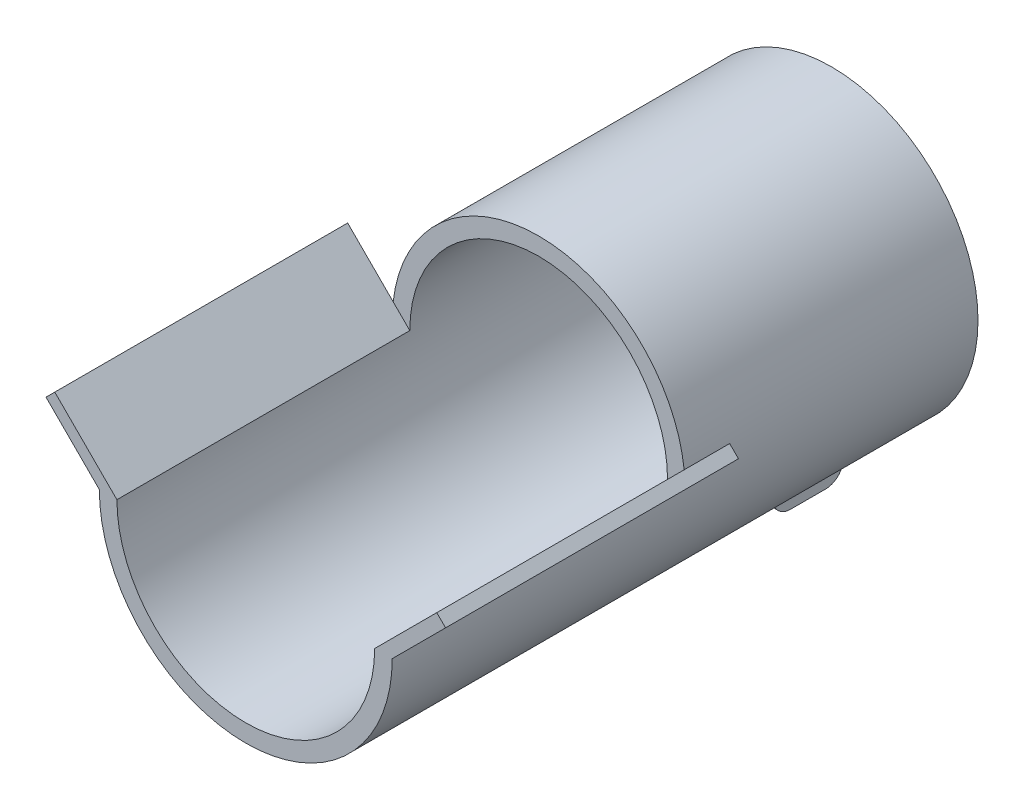
ISO-10303-21;
HEADER;
FILE_DESCRIPTION(('STEP AP214'),'2;1');
FILE_NAME('part.step','',(''),(''),'','','');
FILE_SCHEMA(('AUTOMOTIVE_DESIGN { 1 0 10303 214 1 1 1 1 }'));
ENDSEC;
DATA;
#1=APPLICATION_CONTEXT('core data for automotive mechanical design processes');
#2=APPLICATION_PROTOCOL_DEFINITION('international standard','automotive_design',2000,#1);
#3=PRODUCT_CONTEXT('',#1,'mechanical');
#4=PRODUCT('Part','Part','',(#3));
#5=PRODUCT_RELATED_PRODUCT_CATEGORY('part','',(#4));
#6=PRODUCT_DEFINITION_FORMATION('','',#4);
#7=PRODUCT_DEFINITION_CONTEXT('part definition',#1,'design');
#8=PRODUCT_DEFINITION('design','',#6,#7);
#9=PRODUCT_DEFINITION_SHAPE('','',#8);
#10=(LENGTH_UNIT() NAMED_UNIT(*) SI_UNIT(.MILLI.,.METRE.));
#11=(NAMED_UNIT(*) PLANE_ANGLE_UNIT() SI_UNIT($,.RADIAN.));
#12=(NAMED_UNIT(*) SI_UNIT($,.STERADIAN.) SOLID_ANGLE_UNIT());
#13=UNCERTAINTY_MEASURE_WITH_UNIT(LENGTH_MEASURE(1.E-05),#10,'distance_accuracy_value','');
#14=(GEOMETRIC_REPRESENTATION_CONTEXT(3) GLOBAL_UNCERTAINTY_ASSIGNED_CONTEXT((#13)) GLOBAL_UNIT_ASSIGNED_CONTEXT((#10,
#11,#12)) REPRESENTATION_CONTEXT('',''));
#15=CARTESIAN_POINT('',(0.,0.,0.));
#16=DIRECTION('',(0.,0.,1.));
#17=DIRECTION('',(1.,0.,0.));
#18=AXIS2_PLACEMENT_3D('',#15,#16,#17);
#19=CARTESIAN_POINT('',(0.,0.,100.));
#20=DIRECTION('',(0.,0.,1.));
#21=DIRECTION('',(1.,0.,0.));
#22=AXIS2_PLACEMENT_3D('',#19,#20,#21);
#23=PLANE('',#22);
#24=CARTESIAN_POINT('',(0.,0.,100.));
#25=DIRECTION('',(0.,0.,1.));
#26=DIRECTION('',(1.,0.,0.));
#27=AXIS2_PLACEMENT_3D('',#24,#25,#26);
#28=CIRCLE('',#27,22.);
#29=CARTESIAN_POINT('',(-22.,0.,100.));
#30=VERTEX_POINT('',#29);
#31=CARTESIAN_POINT('',(22.,0.,100.));
#32=VERTEX_POINT('',#31);
#33=EDGE_CURVE('E219',#30,#32,#28,.T.);
#34=ORIENTED_EDGE('',*,*,#33,.F.);
#35=DIRECTION('',(-0.707106781186546,0.707106781186549,0.));
#36=VECTOR('',#35,1.);
#37=CARTESIAN_POINT('',(-22.,0.,100.));
#38=LINE('',#37,#36);
#39=CARTESIAN_POINT('',(-32.6066017177982,10.6066017177982,100.));
#40=VERTEX_POINT('',#39);
#41=EDGE_CURVE('E205',#30,#40,#38,.T.);
#42=ORIENTED_EDGE('',*,*,#41,.T.);
#43=DIRECTION('',(-0.707106781186548,-0.707106781186547,0.));
#44=VECTOR('',#43,1.);
#45=CARTESIAN_POINT('',(-32.6066017177982,10.6066017177982,100.));
#46=LINE('',#45,#44);
#47=CARTESIAN_POINT('',(-34.1066017177982,9.10660171779823,100.));
#48=VERTEX_POINT('',#47);
#49=EDGE_CURVE('E212',#40,#48,#46,.T.);
#50=ORIENTED_EDGE('',*,*,#49,.T.);
#51=DIRECTION('',(0.707106781186546,-0.707106781186549,0.));
#52=VECTOR('',#51,1.);
#53=CARTESIAN_POINT('',(-34.1066017177982,9.10660171779823,100.));
#54=LINE('',#53,#52);
#55=CARTESIAN_POINT('',(-25.,0.,100.));
#56=VERTEX_POINT('',#55);
#57=EDGE_CURVE('E220',#48,#56,#54,.T.);
#58=ORIENTED_EDGE('',*,*,#57,.T.);
#59=CARTESIAN_POINT('',(0.,0.,100.));
#60=DIRECTION('',(0.,0.,1.));
#61=DIRECTION('',(1.,0.,0.));
#62=AXIS2_PLACEMENT_3D('',#59,#60,#61);
#63=CIRCLE('',#62,25.);
#64=CARTESIAN_POINT('',(25.,0.,100.));
#65=VERTEX_POINT('',#64);
#66=EDGE_CURVE('E297',#56,#65,#63,.T.);
#67=ORIENTED_EDGE('',*,*,#66,.T.);
#68=DIRECTION('',(0.707106781186546,0.707106781186549,0.));
#69=VECTOR('',#68,1.);
#70=CARTESIAN_POINT('',(34.1066017177982,9.10660171779823,100.));
#71=LINE('',#70,#69);
#72=CARTESIAN_POINT('',(34.1066017177982,9.10660171779823,100.));
#73=VERTEX_POINT('',#72);
#74=EDGE_CURVE('E235',#65,#73,#71,.T.);
#75=ORIENTED_EDGE('',*,*,#74,.T.);
#76=DIRECTION('',(-0.70710678118655,0.707106781186545,0.));
#77=VECTOR('',#76,1.);
#78=CARTESIAN_POINT('',(32.6066017177982,10.6066017177982,100.));
#79=LINE('',#78,#77);
#80=CARTESIAN_POINT('',(32.6066017177982,10.6066017177982,100.));
#81=VERTEX_POINT('',#80);
#82=EDGE_CURVE('E238',#73,#81,#79,.T.);
#83=ORIENTED_EDGE('',*,*,#82,.T.);
#84=DIRECTION('',(-0.707106781186546,-0.707106781186549,0.));
#85=VECTOR('',#84,1.);
#86=CARTESIAN_POINT('',(22.,0.,100.));
#87=LINE('',#86,#85);
#88=EDGE_CURVE('E242',#81,#32,#87,.T.);
#89=ORIENTED_EDGE('',*,*,#88,.T.);
#90=EDGE_LOOP('',(#34,#42,#50,#58,#67,#75,#83,#89));
#91=FACE_BOUND('',#90,.T.);
#92=ADVANCED_FACE('F35',(#91),#23,.T.);
#93=CARTESIAN_POINT('',(0.,0.,0.));
#94=DIRECTION('',(0.,0.,1.));
#95=DIRECTION('',(1.,0.,0.));
#96=AXIS2_PLACEMENT_3D('',#93,#94,#95);
#97=PLANE('',#96);
#98=CARTESIAN_POINT('',(8.,17.2336879396141,0.));
#99=DIRECTION('',(0.,0.,1.));
#100=DIRECTION('',(1.,0.,0.));
#101=AXIS2_PLACEMENT_3D('',#98,#99,#100);
#102=CIRCLE('',#101,3.);
#103=CARTESIAN_POINT('',(9.26315789473684,19.9547965616584,0.));
#104=VERTEX_POINT('',#103);
#105=CARTESIAN_POINT('',(5.00284428152018,17.3642926837229,0.));
#106=VERTEX_POINT('',#105);
#107=EDGE_CURVE('E312',#104,#106,#102,.T.);
#108=ORIENTED_EDGE('',*,*,#107,.T.);
#109=CARTESIAN_POINT('',(2.00568856304037,17.4948974278318,0.));
#110=DIRECTION('',(0.,0.,1.));
#111=DIRECTION('',(1.,0.,0.));
#112=AXIS2_PLACEMENT_3D('',#109,#110,#111);
#113=CIRCLE('',#112,3.);
#114=CARTESIAN_POINT('',(2.00568856304037,14.4948974278318,0.));
#115=VERTEX_POINT('',#114);
#116=EDGE_CURVE('E787',#106,#115,#113,.F.);
#117=ORIENTED_EDGE('',*,*,#116,.T.);
#118=DIRECTION('',(-1.,0.,0.));
#119=VECTOR('',#118,1.);
#120=CARTESIAN_POINT('',(5.,14.4948974278318,0.));
#121=LINE('',#120,#119);
#122=CARTESIAN_POINT('',(-2.00568856304037,14.4948974278318,0.));
#123=VERTEX_POINT('',#122);
#124=EDGE_CURVE('E289',#115,#123,#121,.T.);
#125=ORIENTED_EDGE('',*,*,#124,.T.);
#126=CARTESIAN_POINT('',(-2.00568856304037,17.4948974278318,0.));
#127=DIRECTION('',(0.,0.,1.));
#128=DIRECTION('',(1.,0.,0.));
#129=AXIS2_PLACEMENT_3D('',#126,#127,#128);
#130=CIRCLE('',#129,3.);
#131=CARTESIAN_POINT('',(-5.00284428152019,17.3642926837229,0.));
#132=VERTEX_POINT('',#131);
#133=EDGE_CURVE('E772',#123,#132,#130,.F.);
#134=ORIENTED_EDGE('',*,*,#133,.T.);
#135=CARTESIAN_POINT('',(-8.,17.2336879396141,0.));
#136=DIRECTION('',(0.,0.,1.));
#137=DIRECTION('',(1.,0.,0.));
#138=AXIS2_PLACEMENT_3D('',#135,#136,#137);
#139=CIRCLE('',#138,3.);
#140=CARTESIAN_POINT('',(-9.26315789473684,19.9547965616584,0.));
#141=VERTEX_POINT('',#140);
#142=EDGE_CURVE('E315',#132,#141,#139,.T.);
#143=ORIENTED_EDGE('',*,*,#142,.T.);
#144=CARTESIAN_POINT('',(0.,0.,0.));
#145=DIRECTION('',(0.,0.,1.));
#146=DIRECTION('',(1.,0.,0.));
#147=AXIS2_PLACEMENT_3D('',#144,#145,#146);
#148=CIRCLE('',#147,22.);
#149=EDGE_CURVE('E288',#141,#104,#148,.T.);
#150=ORIENTED_EDGE('',*,*,#149,.T.);
#151=EDGE_LOOP('',(#108,#117,#125,#134,#143,#150));
#152=FACE_BOUND('',#151,.T.);
#153=DIRECTION('',(0.,-1.,0.));
#154=VECTOR('',#153,1.);
#155=CARTESIAN_POINT('',(2.,-24.9198715887542,0.));
#156=LINE('',#155,#154);
#157=CARTESIAN_POINT('',(2.,-27.5499546279118,0.));
#158=VERTEX_POINT('',#157);
#159=CARTESIAN_POINT('',(2.,-31.9198715887542,0.));
#160=VERTEX_POINT('',#159);
#161=EDGE_CURVE('E271',#158,#160,#156,.T.);
#162=ORIENTED_EDGE('',*,*,#161,.T.);
#163=DIRECTION('',(-1.,0.,0.));
#164=VECTOR('',#163,1.);
#165=CARTESIAN_POINT('',(-2.,-31.9198715887542,0.));
#166=LINE('',#165,#164);
#167=CARTESIAN_POINT('',(-2.,-31.9198715887542,0.));
#168=VERTEX_POINT('',#167);
#169=EDGE_CURVE('E473',#160,#168,#166,.T.);
#170=ORIENTED_EDGE('',*,*,#169,.T.);
#171=DIRECTION('',(0.,1.,0.));
#172=VECTOR('',#171,1.);
#173=CARTESIAN_POINT('',(-2.,-24.9198715887542,0.));
#174=LINE('',#173,#172);
#175=CARTESIAN_POINT('',(-2.,-27.5499546279118,0.));
#176=VERTEX_POINT('',#175);
#177=EDGE_CURVE('E262',#168,#176,#174,.T.);
#178=ORIENTED_EDGE('',*,*,#177,.T.);
#179=CARTESIAN_POINT('',(-5.,-27.5499546279118,0.));
#180=DIRECTION('',(0.,0.,1.));
#181=DIRECTION('',(1.,0.,0.));
#182=AXIS2_PLACEMENT_3D('',#179,#180,#181);
#183=CIRCLE('',#182,3.);
#184=CARTESIAN_POINT('',(-4.46428571428572,-24.5981737749213,0.));
#185=VERTEX_POINT('',#184);
#186=EDGE_CURVE('E391',#176,#185,#183,.T.);
#187=ORIENTED_EDGE('',*,*,#186,.T.);
#188=CARTESIAN_POINT('',(0.,0.,0.));
#189=DIRECTION('',(0.,0.,1.));
#190=DIRECTION('',(1.,0.,0.));
#191=AXIS2_PLACEMENT_3D('',#188,#189,#190);
#192=CIRCLE('',#191,25.);
#193=CARTESIAN_POINT('',(4.46428571428572,-24.5981737749213,0.));
#194=VERTEX_POINT('',#193);
#195=EDGE_CURVE('E294',#194,#185,#192,.T.);
#196=ORIENTED_EDGE('',*,*,#195,.F.);
#197=CARTESIAN_POINT('',(5.,-27.5499546279118,0.));
#198=DIRECTION('',(0.,0.,1.));
#199=DIRECTION('',(1.,0.,0.));
#200=AXIS2_PLACEMENT_3D('',#197,#198,#199);
#201=CIRCLE('',#200,3.);
#202=EDGE_CURVE('E448',#194,#158,#201,.T.);
#203=ORIENTED_EDGE('',*,*,#202,.T.);
#204=EDGE_LOOP('',(#162,#170,#178,#187,#196,#203));
#205=FACE_BOUND('',#204,.T.);
#206=ADVANCED_FACE('F420',(#152,#205),#97,.F.);
#207=CARTESIAN_POINT('',(0.,0.,100.));
#208=DIRECTION('',(0.,0.,-1.));
#209=DIRECTION('',(-1.,0.,0.));
#210=AXIS2_PLACEMENT_3D('',#207,#208,#209);
#211=CYLINDRICAL_SURFACE('',#210,25.);
#212=ORIENTED_EDGE('',*,*,#66,.F.);
#213=DIRECTION('',(0.,0.,-1.));
#214=VECTOR('',#213,1.);
#215=CARTESIAN_POINT('',(-25.,0.,100.));
#216=LINE('',#215,#214);
#217=CARTESIAN_POINT('',(-25.,0.,50.));
#218=VERTEX_POINT('',#217);
#219=EDGE_CURVE('E256',#56,#218,#216,.T.);
#220=ORIENTED_EDGE('',*,*,#219,.T.);
#221=CARTESIAN_POINT('',(0.,0.,50.));
#222=DIRECTION('',(0.,0.,1.));
#223=DIRECTION('',(1.,0.,0.));
#224=AXIS2_PLACEMENT_3D('',#221,#222,#223);
#225=CIRCLE('',#224,25.);
#226=CARTESIAN_POINT('',(-24.8383525030981,2.83835250309806,50.));
#227=VERTEX_POINT('',#226);
#228=EDGE_CURVE('E249',#227,#218,#225,.T.);
#229=ORIENTED_EDGE('',*,*,#228,.F.);
#230=CARTESIAN_POINT('',(24.8383525030981,2.83835250309806,50.));
#231=VERTEX_POINT('',#230);
#232=EDGE_CURVE('E254',#231,#227,#225,.T.);
#233=ORIENTED_EDGE('',*,*,#232,.F.);
#234=CARTESIAN_POINT('',(25.,0.,50.));
#235=VERTEX_POINT('',#234);
#236=EDGE_CURVE('E250',#235,#231,#225,.T.);
#237=ORIENTED_EDGE('',*,*,#236,.F.);
#238=DIRECTION('',(0.,0.,-1.));
#239=VECTOR('',#238,1.);
#240=CARTESIAN_POINT('',(25.,0.,100.));
#241=LINE('',#240,#239);
#242=EDGE_CURVE('E253',#235,#65,#241,.F.);
#243=ORIENTED_EDGE('',*,*,#242,.T.);
#244=EDGE_LOOP('',(#212,#220,#229,#233,#237,#243));
#245=FACE_BOUND('',#244,.T.);
#246=CARTESIAN_POINT('',(0.,0.,15.));
#247=DIRECTION('',(0.,0.,-1.));
#248=DIRECTION('',(-1.,0.,0.));
#249=AXIS2_PLACEMENT_3D('',#246,#247,#248);
#250=CIRCLE('',#249,25.);
#251=CARTESIAN_POINT('',(-4.46428571428572,-24.5981737749213,15.));
#252=VERTEX_POINT('',#251);
#253=CARTESIAN_POINT('',(4.46428571428572,-24.5981737749213,15.));
#254=VERTEX_POINT('',#253);
#255=EDGE_CURVE('E432',#252,#254,#250,.F.);
#256=ORIENTED_EDGE('',*,*,#255,.T.);
#257=DIRECTION('',(0.,0.,-1.));
#258=VECTOR('',#257,1.);
#259=CARTESIAN_POINT('',(4.46428571428572,-24.5981737749213,100.));
#260=LINE('',#259,#258);
#261=EDGE_CURVE('E435',#254,#194,#260,.T.);
#262=ORIENTED_EDGE('',*,*,#261,.T.);
#263=ORIENTED_EDGE('',*,*,#195,.T.);
#264=DIRECTION('',(0.,0.,-1.));
#265=VECTOR('',#264,1.);
#266=CARTESIAN_POINT('',(-4.46428571428572,-24.5981737749213,100.));
#267=LINE('',#266,#265);
#268=EDGE_CURVE('E438',#185,#252,#267,.F.);
#269=ORIENTED_EDGE('',*,*,#268,.T.);
#270=EDGE_LOOP('',(#256,#262,#263,#269));
#271=FACE_BOUND('',#270,.T.);
#272=ADVANCED_FACE('F416',(#245,#271),#211,.T.);
#273=CARTESIAN_POINT('',(0.,0.,100.));
#274=DIRECTION('',(0.,0.,-1.));
#275=DIRECTION('',(-1.,0.,0.));
#276=AXIS2_PLACEMENT_3D('',#273,#274,#275);
#277=CYLINDRICAL_SURFACE('',#276,22.);
#278=DIRECTION('',(0.,0.,-1.));
#279=VECTOR('',#278,1.);
#280=CARTESIAN_POINT('',(-22.,0.,100.));
#281=LINE('',#280,#279);
#282=CARTESIAN_POINT('',(-22.,0.,50.));
#283=VERTEX_POINT('',#282);
#284=EDGE_CURVE('E43',#30,#283,#281,.T.);
#285=ORIENTED_EDGE('',*,*,#284,.F.);
#286=ORIENTED_EDGE('',*,*,#33,.T.);
#287=DIRECTION('',(0.,0.,-1.));
#288=VECTOR('',#287,1.);
#289=CARTESIAN_POINT('',(22.,0.,100.));
#290=LINE('',#289,#288);
#291=CARTESIAN_POINT('',(22.,0.,50.));
#292=VERTEX_POINT('',#291);
#293=EDGE_CURVE('E500',#292,#32,#290,.F.);
#294=ORIENTED_EDGE('',*,*,#293,.F.);
#295=CARTESIAN_POINT('',(0.,0.,50.));
#296=DIRECTION('',(0.,0.,1.));
#297=DIRECTION('',(1.,0.,0.));
#298=AXIS2_PLACEMENT_3D('',#295,#296,#297);
#299=CIRCLE('',#298,22.);
#300=EDGE_CURVE('E499',#292,#283,#299,.T.);
#301=ORIENTED_EDGE('',*,*,#300,.T.);
#302=EDGE_LOOP('',(#285,#286,#294,#301));
#303=FACE_BOUND('',#302,.T.);
#304=CARTESIAN_POINT('',(0.,0.,6.00000000000001));
#305=DIRECTION('',(0.,0.,-1.));
#306=DIRECTION('',(-1.,0.,0.));
#307=AXIS2_PLACEMENT_3D('',#304,#305,#306);
#308=CIRCLE('',#307,22.);
#309=CARTESIAN_POINT('',(-9.26315789473685,19.9547965616584,6.00000000000001));
#310=VERTEX_POINT('',#309);
#311=CARTESIAN_POINT('',(9.26315789473684,19.9547965616584,6.00000000000001));
#312=VERTEX_POINT('',#311);
#313=EDGE_CURVE('E304',#310,#312,#308,.T.);
#314=ORIENTED_EDGE('',*,*,#313,.T.);
#315=DIRECTION('',(0.,0.,-1.));
#316=VECTOR('',#315,1.);
#317=CARTESIAN_POINT('',(9.26315789473684,19.9547965616584,100.));
#318=LINE('',#317,#316);
#319=EDGE_CURVE('E306',#312,#104,#318,.T.);
#320=ORIENTED_EDGE('',*,*,#319,.T.);
#321=ORIENTED_EDGE('',*,*,#149,.F.);
#322=DIRECTION('',(0.,0.,-1.));
#323=VECTOR('',#322,1.);
#324=CARTESIAN_POINT('',(-9.26315789473685,19.9547965616584,100.));
#325=LINE('',#324,#323);
#326=EDGE_CURVE('E300',#141,#310,#325,.F.);
#327=ORIENTED_EDGE('',*,*,#326,.T.);
#328=EDGE_LOOP('',(#314,#320,#321,#327));
#329=FACE_BOUND('',#328,.T.);
#330=ADVANCED_FACE('F409',(#303,#329),#277,.F.);
#331=CARTESIAN_POINT('',(0.,0.,3.));
#332=DIRECTION('',(0.,0.,-1.));
#333=DIRECTION('',(-1.,0.,0.));
#334=AXIS2_PLACEMENT_3D('',#331,#332,#333);
#335=PLANE('',#334);
#336=DIRECTION('',(-1.,0.,0.));
#337=VECTOR('',#336,1.);
#338=CARTESIAN_POINT('',(5.,14.4948974278318,3.));
#339=LINE('',#338,#337);
#340=CARTESIAN_POINT('',(2.00568856304037,14.4948974278318,3.));
#341=VERTEX_POINT('',#340);
#342=CARTESIAN_POINT('',(-2.00568856304037,14.4948974278318,3.));
#343=VERTEX_POINT('',#342);
#344=EDGE_CURVE('E285',#341,#343,#339,.T.);
#345=ORIENTED_EDGE('',*,*,#344,.F.);
#346=CARTESIAN_POINT('',(2.00568856304037,17.4948974278318,3.));
#347=DIRECTION('',(0.,0.,-1.));
#348=DIRECTION('',(-1.,0.,0.));
#349=AXIS2_PLACEMENT_3D('',#346,#347,#348);
#350=CIRCLE('',#349,3.);
#351=CARTESIAN_POINT('',(5.00284428152018,17.3642926837229,3.));
#352=VERTEX_POINT('',#351);
#353=EDGE_CURVE('E778',#341,#352,#350,.F.);
#354=ORIENTED_EDGE('',*,*,#353,.T.);
#355=CARTESIAN_POINT('',(8.,17.2336879396141,3.));
#356=DIRECTION('',(0.,0.,-1.));
#357=DIRECTION('',(-1.,0.,0.));
#358=AXIS2_PLACEMENT_3D('',#355,#356,#357);
#359=CIRCLE('',#358,3.);
#360=CARTESIAN_POINT('',(5.1876615498993,18.2780788827408,3.));
#361=VERTEX_POINT('',#360);
#362=EDGE_CURVE('E310',#352,#361,#359,.T.);
#363=ORIENTED_EDGE('',*,*,#362,.T.);
#364=CARTESIAN_POINT('',(0.,0.,3.));
#365=DIRECTION('',(0.,0.,-1.));
#366=DIRECTION('',(-1.,0.,0.));
#367=AXIS2_PLACEMENT_3D('',#364,#365,#366);
#368=CIRCLE('',#367,19.);
#369=CARTESIAN_POINT('',(-5.1876615498993,18.2780788827408,3.));
#370=VERTEX_POINT('',#369);
#371=EDGE_CURVE('E308',#361,#370,#368,.F.);
#372=ORIENTED_EDGE('',*,*,#371,.T.);
#373=CARTESIAN_POINT('',(-8.,17.2336879396141,3.));
#374=DIRECTION('',(0.,0.,-1.));
#375=DIRECTION('',(-1.,0.,0.));
#376=AXIS2_PLACEMENT_3D('',#373,#374,#375);
#377=CIRCLE('',#376,3.);
#378=CARTESIAN_POINT('',(-5.00284428152019,17.3642926837229,3.));
#379=VERTEX_POINT('',#378);
#380=EDGE_CURVE('E317',#370,#379,#377,.T.);
#381=ORIENTED_EDGE('',*,*,#380,.T.);
#382=CARTESIAN_POINT('',(-2.00568856304037,17.4948974278318,3.));
#383=DIRECTION('',(0.,0.,-1.));
#384=DIRECTION('',(-1.,0.,0.));
#385=AXIS2_PLACEMENT_3D('',#382,#383,#384);
#386=CIRCLE('',#385,3.);
#387=EDGE_CURVE('E777',#379,#343,#386,.F.);
#388=ORIENTED_EDGE('',*,*,#387,.T.);
#389=EDGE_LOOP('',(#345,#354,#363,#372,#381,#388));
#390=FACE_BOUND('',#389,.T.);
#391=ADVANCED_FACE('F406',(#390),#335,.F.);
#392=CARTESIAN_POINT('',(5.,14.4948974278318,3.));
#393=DIRECTION('',(0.,-1.,0.));
#394=DIRECTION('',(0.,0.,-1.));
#395=AXIS2_PLACEMENT_3D('',#392,#393,#394);
#396=PLANE('',#395);
#397=ORIENTED_EDGE('',*,*,#124,.F.);
#398=DIRECTION('',(0.,0.,1.));
#399=VECTOR('',#398,1.);
#400=CARTESIAN_POINT('',(2.00568856304037,14.4948974278318,3.));
#401=LINE('',#400,#399);
#402=EDGE_CURVE('E783',#115,#341,#401,.T.);
#403=ORIENTED_EDGE('',*,*,#402,.T.);
#404=ORIENTED_EDGE('',*,*,#344,.T.);
#405=DIRECTION('',(0.,0.,1.));
#406=VECTOR('',#405,1.);
#407=CARTESIAN_POINT('',(-2.00568856304037,14.4948974278318,0.));
#408=LINE('',#407,#406);
#409=EDGE_CURVE('E785',#343,#123,#408,.F.);
#410=ORIENTED_EDGE('',*,*,#409,.T.);
#411=EDGE_LOOP('',(#397,#403,#404,#410));
#412=FACE_BOUND('',#411,.T.);
#413=ADVANCED_FACE('F347',(#412),#396,.T.);
#414=CARTESIAN_POINT('',(-8.,17.2336879396141,100.));
#415=DIRECTION('',(0.,0.,-1.));
#416=DIRECTION('',(-1.,0.,0.));
#417=AXIS2_PLACEMENT_3D('',#414,#415,#416);
#418=CYLINDRICAL_SURFACE('',#417,3.);
#419=ORIENTED_EDGE('',*,*,#142,.F.);
#420=DIRECTION('',(0.,0.,-1.));
#421=VECTOR('',#420,1.);
#422=CARTESIAN_POINT('',(-5.00284428152019,17.3642926837229,100.));
#423=LINE('',#422,#421);
#424=EDGE_CURVE('E441',#132,#379,#423,.F.);
#425=ORIENTED_EDGE('',*,*,#424,.T.);
#426=ORIENTED_EDGE('',*,*,#380,.F.);
#427=CARTESIAN_POINT('',(-5.1876615498993,18.2780788827408,3.));
#428=CARTESIAN_POINT('',(-5.21148827864978,18.3422885196551,2.99998436107467));
#429=CARTESIAN_POINT('',(-5.23753857797068,18.4056528076145,3.00233021261606));
#430=CARTESIAN_POINT('',(-5.29373582279378,18.5301315414217,3.01154494223623));
#431=CARTESIAN_POINT('',(-5.32387901993957,18.5912479815545,3.01840970368977));
#432=CARTESIAN_POINT('',(-5.38768369900595,18.7102823305853,3.03638623829649));
#433=CARTESIAN_POINT('',(-5.4213130882158,18.7682230163955,3.04746140564697));
#434=CARTESIAN_POINT('',(-5.491910671019,18.8810874125705,3.07357849905552));
#435=CARTESIAN_POINT('',(-5.52887948322444,18.9360105609078,3.08862116106785));
#436=CARTESIAN_POINT('',(-5.64393486072138,19.0954198052732,3.13912515247358));
#437=CARTESIAN_POINT('',(-5.72645373656414,19.19506717941,3.1800456341603));
#438=CARTESIAN_POINT('',(-5.90028312540132,19.3801755318174,3.27387878203893));
#439=CARTESIAN_POINT('',(-5.99161426361007,19.4656018877317,3.32681999460609));
#440=CARTESIAN_POINT('',(-6.21809006008137,19.6532288274738,3.46531156628652));
#441=CARTESIAN_POINT('',(-6.3561736298364,19.7485176388935,3.55544379395711));
#442=CARTESIAN_POINT('',(-6.63874179995762,19.9120717962027,3.7490275607956));
#443=CARTESIAN_POINT('',(-6.78323605959351,19.9802947091904,3.8524996799323));
#444=CARTESIAN_POINT('',(-7.1218478563509,20.1097014612587,4.1038673510328));
#445=CARTESIAN_POINT('',(-7.31691405780485,20.1614885429659,4.25531411208525));
#446=CARTESIAN_POINT('',(-7.70516575113241,20.2256569522246,4.56858580598001));
#447=CARTESIAN_POINT('',(-7.89834801419077,20.2379795548313,4.73042583982242));
#448=CARTESIAN_POINT('',(-8.29369130560812,20.2263423303663,5.073681467878));
#449=CARTESIAN_POINT('',(-8.495299018368,20.1993403715666,5.25561690713688));
#450=CARTESIAN_POINT('',(-8.88587413544158,20.1069019358501,5.62244946819125));
#451=CARTESIAN_POINT('',(-9.07487040625027,20.0415568369633,5.80733853534225));
#452=CARTESIAN_POINT('',(-9.2579349119087,19.9572165402489,5.99465048530846));
#453=CARTESIAN_POINT('',(-9.26054730388718,19.9560084157496,5.99732527204705));
#454=CARTESIAN_POINT('',(-9.26315789473684,19.9547965616584,6.00000000000001));
#455=B_SPLINE_CURVE_WITH_KNOTS('',3,(#427,#428,#429,#430,#431,#432,#433,#434,#435,#436,#437,
#438,#439,#440,#441,#442,#443,#444,#445,#446,#447,#448,#449,#450,#451,#452,#453,#454),
.UNSPECIFIED.,.F.,.F.,(4,2,2,2,2,2,2,2,2,2,2,2,2,4),(0.,0.20535382669792,0.410520839088112,
0.613943451166022,0.817403823890078,1.22255044900462,1.62866945467876,2.19686729789434,
2.76595245315343,3.51891343473326,4.27299433725352,5.08859710894773,5.90226401392648,
5.91405161431128),.UNSPECIFIED.);
#456=EDGE_CURVE('E292',#310,#370,#455,.F.);
#457=ORIENTED_EDGE('',*,*,#456,.F.);
#458=ORIENTED_EDGE('',*,*,#326,.F.);
#459=EDGE_LOOP('',(#419,#425,#426,#457,#458));
#460=FACE_BOUND('',#459,.T.);
#461=ADVANCED_FACE('F343',(#460),#418,.F.);
#462=CARTESIAN_POINT('',(0.,0.,6.00000000000001));
#463=DIRECTION('',(0.,0.,-1.));
#464=DIRECTION('',(-1.,0.,0.));
#465=AXIS2_PLACEMENT_3D('',#462,#463,#464);
#466=TOROIDAL_SURFACE('',#465,19.,3.);
#467=ORIENTED_EDGE('',*,*,#371,.F.);
#468=CARTESIAN_POINT('',(5.1876615498993,18.2780788827408,3.));
#469=CARTESIAN_POINT('',(5.21148827864978,18.3422885196551,2.99998436107467));
#470=CARTESIAN_POINT('',(5.23753857797068,18.4056528076145,3.00233021261606));
#471=CARTESIAN_POINT('',(5.29373582279377,18.5301315414217,3.01154494223623));
#472=CARTESIAN_POINT('',(5.32387901993956,18.5912479815545,3.01840970368977));
#473=CARTESIAN_POINT('',(5.38768369900594,18.7102823305853,3.03638623829649));
#474=CARTESIAN_POINT('',(5.4213130882158,18.7682230163955,3.04746140564697));
#475=CARTESIAN_POINT('',(5.49191067101899,18.8810874125705,3.07357849905552));
#476=CARTESIAN_POINT('',(5.52887948322444,18.9360105609078,3.08862116106785));
#477=CARTESIAN_POINT('',(5.64393486072138,19.0954198052732,3.13912515247358));
#478=CARTESIAN_POINT('',(5.72645373656414,19.19506717941,3.18004563416031));
#479=CARTESIAN_POINT('',(5.90028312540133,19.3801755318175,3.27387878203894));
#480=CARTESIAN_POINT('',(5.99161426361008,19.4656018877317,3.32681999460609));
#481=CARTESIAN_POINT('',(6.21809006008136,19.6532288274738,3.46531156628652));
#482=CARTESIAN_POINT('',(6.35617362983637,19.7485176388935,3.55544379395712));
#483=CARTESIAN_POINT('',(6.63874179995761,19.9120717962027,3.74902756079558));
#484=CARTESIAN_POINT('',(6.78323605959355,19.9802947091904,3.85249967993224));
#485=CARTESIAN_POINT('',(7.12184785635087,20.1097014612588,4.10386735103289));
#486=CARTESIAN_POINT('',(7.31691405780464,20.161488542966,4.25531411208561));
#487=CARTESIAN_POINT('',(7.70516575113273,20.2256569522245,4.56858580597974));
#488=CARTESIAN_POINT('',(7.89834801419179,20.2379795548308,4.73042583982126));
#489=CARTESIAN_POINT('',(8.29369130560703,20.2263423303668,5.07368146787929));
#490=CARTESIAN_POINT('',(8.49529901836377,20.1993403715686,5.25561690714187));
#491=CARTESIAN_POINT('',(8.88587413544577,20.1069019358482,5.62244946818623));
#492=CARTESIAN_POINT('',(9.07487040626599,20.0415568369559,5.80733853532355));
#493=CARTESIAN_POINT('',(9.25793491190915,19.9572165402487,5.99465048530792));
#494=CARTESIAN_POINT('',(9.26054730388741,19.9560084157495,5.99732527204677));
#495=CARTESIAN_POINT('',(9.26315789473684,19.9547965616584,6.00000000000001));
#496=B_SPLINE_CURVE_WITH_KNOTS('',3,(#468,#469,#470,#471,#472,#473,#474,#475,#476,#477,#478,
#479,#480,#481,#482,#483,#484,#485,#486,#487,#488,#489,#490,#491,#492,#493,#494,#495),
.UNSPECIFIED.,.F.,.F.,(4,2,2,2,2,2,2,2,2,2,2,2,2,4),(0.,0.205353826697916,0.410520839088104,
0.613943451166018,0.817403823890079,1.22255044900464,1.62866945467876,2.19686729789431,
2.76595245315344,3.51891343473336,4.27299433725353,5.08859710894769,5.90226401392648,
5.91405161431128),.UNSPECIFIED.);
#497=EDGE_CURVE('E282',#312,#361,#496,.F.);
#498=ORIENTED_EDGE('',*,*,#497,.F.);
#499=ORIENTED_EDGE('',*,*,#313,.F.);
#500=ORIENTED_EDGE('',*,*,#456,.T.);
#501=EDGE_LOOP('',(#467,#498,#499,#500));
#502=FACE_BOUND('',#501,.T.);
#503=ADVANCED_FACE('F335',(#502),#466,.F.);
#504=CARTESIAN_POINT('',(8.,17.2336879396141,100.));
#505=DIRECTION('',(0.,0.,-1.));
#506=DIRECTION('',(-1.,0.,0.));
#507=AXIS2_PLACEMENT_3D('',#504,#505,#506);
#508=CYLINDRICAL_SURFACE('',#507,3.);
#509=ORIENTED_EDGE('',*,*,#362,.F.);
#510=DIRECTION('',(0.,0.,-1.));
#511=VECTOR('',#510,1.);
#512=CARTESIAN_POINT('',(5.00284428152018,17.3642926837229,100.));
#513=LINE('',#512,#511);
#514=EDGE_CURVE('E320',#352,#106,#513,.T.);
#515=ORIENTED_EDGE('',*,*,#514,.T.);
#516=ORIENTED_EDGE('',*,*,#107,.F.);
#517=ORIENTED_EDGE('',*,*,#319,.F.);
#518=ORIENTED_EDGE('',*,*,#497,.T.);
#519=EDGE_LOOP('',(#509,#515,#516,#517,#518));
#520=FACE_BOUND('',#519,.T.);
#521=ADVANCED_FACE('F338',(#520),#508,.F.);
#522=CARTESIAN_POINT('',(2.00568856304037,17.4948974278318,100.));
#523=DIRECTION('',(0.,0.,-1.));
#524=DIRECTION('',(-1.,0.,0.));
#525=AXIS2_PLACEMENT_3D('',#522,#523,#524);
#526=CYLINDRICAL_SURFACE('',#525,3.);
#527=ORIENTED_EDGE('',*,*,#353,.F.);
#528=ORIENTED_EDGE('',*,*,#402,.F.);
#529=ORIENTED_EDGE('',*,*,#116,.F.);
#530=ORIENTED_EDGE('',*,*,#514,.F.);
#531=EDGE_LOOP('',(#527,#528,#529,#530));
#532=FACE_BOUND('',#531,.T.);
#533=ADVANCED_FACE('F341',(#532),#526,.T.);
#534=CARTESIAN_POINT('',(-2.00568856304037,17.4948974278318,100.));
#535=DIRECTION('',(0.,0.,-1.));
#536=DIRECTION('',(-1.,0.,0.));
#537=AXIS2_PLACEMENT_3D('',#534,#535,#536);
#538=CYLINDRICAL_SURFACE('',#537,3.);
#539=ORIENTED_EDGE('',*,*,#387,.F.);
#540=ORIENTED_EDGE('',*,*,#424,.F.);
#541=ORIENTED_EDGE('',*,*,#133,.F.);
#542=ORIENTED_EDGE('',*,*,#409,.F.);
#543=EDGE_LOOP('',(#539,#540,#541,#542));
#544=FACE_BOUND('',#543,.T.);
#545=ADVANCED_FACE('F351',(#544),#538,.T.);
#546=CARTESIAN_POINT('',(-2.,-24.9198715887542,12.));
#547=DIRECTION('',(-1.,0.,0.));
#548=DIRECTION('',(0.,-1.,0.));
#549=AXIS2_PLACEMENT_3D('',#546,#547,#548);
#550=PLANE('',#549);
#551=CARTESIAN_POINT('',(-2.,-30.9198715887542,5.));
#552=DIRECTION('',(-1.,0.,0.));
#553=DIRECTION('',(0.,-1.,0.));
#554=AXIS2_PLACEMENT_3D('',#551,#552,#553);
#555=CIRCLE('',#554,1.5);
#556=CARTESIAN_POINT('',(-2.,-32.4198715887542,5.));
#557=VERTEX_POINT('',#556);
#558=EDGE_CURVE('E259',#557,#557,#555,.T.);
#559=ORIENTED_EDGE('',*,*,#558,.F.);
#560=EDGE_LOOP('',(#559));
#561=FACE_BOUND('',#560,.T.);
#562=DIRECTION('',(0.,1.,0.));
#563=VECTOR('',#562,1.);
#564=CARTESIAN_POINT('',(-2.,-24.9198715887542,12.));
#565=LINE('',#564,#563);
#566=CARTESIAN_POINT('',(-2.,-31.9198715887542,12.));
#567=VERTEX_POINT('',#566);
#568=CARTESIAN_POINT('',(-2.,-27.9284800875379,12.));
#569=VERTEX_POINT('',#568);
#570=EDGE_CURVE('E267',#567,#569,#565,.T.);
#571=ORIENTED_EDGE('',*,*,#570,.T.);
#572=CARTESIAN_POINT('',(-2.,-27.9284800875379,12.));
#573=CARTESIAN_POINT('',(-2.,-27.8651422734835,12.0000040166201));
#574=CARTESIAN_POINT('',(-2.,-27.8019295770528,12.001993655635));
#575=CARTESIAN_POINT('',(-2.,-27.6757544238617,12.0099441781761));
#576=CARTESIAN_POINT('',(-2.,-27.6127919670837,12.0159050614237));
#577=CARTESIAN_POINT('',(-2.,-27.5499546279118,12.0238515667879));
#578=B_SPLINE_CURVE_WITH_KNOTS('',3,(#572,#573,#574,#575,#576,#577),.UNSPECIFIED.,.F.,.F.,(4,2,
4),(0.,0.189732002785688,0.379463992269507),.UNSPECIFIED.);
#579=CARTESIAN_POINT('',(-2.,-27.5499546279118,12.0238515667879));
#580=VERTEX_POINT('',#579);
#581=EDGE_CURVE('E382',#569,#580,#578,.T.);
#582=ORIENTED_EDGE('',*,*,#581,.T.);
#583=DIRECTION('',(0.,0.,-1.));
#584=VECTOR('',#583,1.);
#585=CARTESIAN_POINT('',(-2.,-27.5499546279118,12.));
#586=LINE('',#585,#584);
#587=EDGE_CURVE('E462',#580,#176,#586,.T.);
#588=ORIENTED_EDGE('',*,*,#587,.T.);
#589=ORIENTED_EDGE('',*,*,#177,.F.);
#590=CARTESIAN_POINT('',(-2.,-31.9198715887542,3.));
#591=DIRECTION('',(-1.,0.,0.));
#592=DIRECTION('',(0.,-1.,0.));
#593=AXIS2_PLACEMENT_3D('',#590,#591,#592);
#594=CIRCLE('',#593,3.);
#595=CARTESIAN_POINT('',(-2.,-34.9198715887542,3.));
#596=VERTEX_POINT('',#595);
#597=EDGE_CURVE('E458',#168,#596,#594,.T.);
#598=ORIENTED_EDGE('',*,*,#597,.T.);
#599=DIRECTION('',(0.,0.,-1.));
#600=VECTOR('',#599,1.);
#601=CARTESIAN_POINT('',(-2.,-34.9198715887542,12.));
#602=LINE('',#601,#600);
#603=CARTESIAN_POINT('',(-2.,-34.9198715887542,9.));
#604=VERTEX_POINT('',#603);
#605=EDGE_CURVE('E279',#604,#596,#602,.T.);
#606=ORIENTED_EDGE('',*,*,#605,.F.);
#607=CARTESIAN_POINT('',(-2.,-31.9198715887542,9.));
#608=DIRECTION('',(-1.,0.,0.));
#609=DIRECTION('',(0.,-1.,0.));
#610=AXIS2_PLACEMENT_3D('',#607,#608,#609);
#611=CIRCLE('',#610,3.);
#612=EDGE_CURVE('E460',#604,#567,#611,.T.);
#613=ORIENTED_EDGE('',*,*,#612,.T.);
#614=EDGE_LOOP('',(#571,#582,#588,#589,#598,#606,#613));
#615=FACE_BOUND('',#614,.T.);
#616=ADVANCED_FACE('F355',(#561,#615),#550,.T.);
#617=CARTESIAN_POINT('',(2.,-34.9198715887542,12.));
#618=DIRECTION('',(0.,-1.,0.));
#619=DIRECTION('',(0.,0.,-1.));
#620=AXIS2_PLACEMENT_3D('',#617,#618,#619);
#621=PLANE('',#620);
#622=DIRECTION('',(0.,0.,-1.));
#623=VECTOR('',#622,1.);
#624=CARTESIAN_POINT('',(2.,-34.9198715887542,12.));
#625=LINE('',#624,#623);
#626=CARTESIAN_POINT('',(2.,-34.9198715887542,9.));
#627=VERTEX_POINT('',#626);
#628=CARTESIAN_POINT('',(2.,-34.9198715887542,3.));
#629=VERTEX_POINT('',#628);
#630=EDGE_CURVE('E274',#627,#629,#625,.T.);
#631=ORIENTED_EDGE('',*,*,#630,.F.);
#632=DIRECTION('',(-1.,0.,0.));
#633=VECTOR('',#632,1.);
#634=CARTESIAN_POINT('',(-2.,-34.9198715887542,9.));
#635=LINE('',#634,#633);
#636=EDGE_CURVE('E470',#627,#604,#635,.T.);
#637=ORIENTED_EDGE('',*,*,#636,.T.);
#638=ORIENTED_EDGE('',*,*,#605,.T.);
#639=DIRECTION('',(-1.,0.,0.));
#640=VECTOR('',#639,1.);
#641=CARTESIAN_POINT('',(2.,-34.9198715887542,3.));
#642=LINE('',#641,#640);
#643=EDGE_CURVE('E468',#596,#629,#642,.F.);
#644=ORIENTED_EDGE('',*,*,#643,.T.);
#645=EDGE_LOOP('',(#631,#637,#638,#644));
#646=FACE_BOUND('',#645,.T.);
#647=ADVANCED_FACE('F401',(#646),#621,.T.);
#648=CARTESIAN_POINT('',(2.,-24.9198715887542,12.));
#649=DIRECTION('',(1.,0.,0.));
#650=DIRECTION('',(0.,1.,0.));
#651=AXIS2_PLACEMENT_3D('',#648,#649,#650);
#652=PLANE('',#651);
#653=CARTESIAN_POINT('',(2.,-30.9198715887542,5.));
#654=DIRECTION('',(1.,0.,0.));
#655=DIRECTION('',(0.,1.,0.));
#656=AXIS2_PLACEMENT_3D('',#653,#654,#655);
#657=CIRCLE('',#656,1.5);
#658=CARTESIAN_POINT('',(2.,-29.4198715887542,5.));
#659=VERTEX_POINT('',#658);
#660=EDGE_CURVE('E263',#659,#659,#657,.F.);
#661=ORIENTED_EDGE('',*,*,#660,.T.);
#662=EDGE_LOOP('',(#661));
#663=FACE_BOUND('',#662,.T.);
#664=ORIENTED_EDGE('',*,*,#161,.F.);
#665=DIRECTION('',(0.,0.,-1.));
#666=VECTOR('',#665,1.);
#667=CARTESIAN_POINT('',(2.,-27.5499546279118,12.));
#668=LINE('',#667,#666);
#669=CARTESIAN_POINT('',(2.,-27.5499546279118,12.0238515667879));
#670=VERTEX_POINT('',#669);
#671=EDGE_CURVE('E456',#158,#670,#668,.F.);
#672=ORIENTED_EDGE('',*,*,#671,.T.);
#673=CARTESIAN_POINT('',(2.,-27.5499546279118,12.0238515667879));
#674=CARTESIAN_POINT('',(2.,-27.6127919670837,12.0159050614237));
#675=CARTESIAN_POINT('',(2.,-27.6757544238616,12.0099441781761));
#676=CARTESIAN_POINT('',(2.,-27.8019295770528,12.001993655635));
#677=CARTESIAN_POINT('',(2.,-27.8651422734835,12.00000401662));
#678=CARTESIAN_POINT('',(2.,-27.9284800875379,12.));
#679=B_SPLINE_CURVE_WITH_KNOTS('',3,(#673,#674,#675,#676,#677,#678),.UNSPECIFIED.,.F.,.F.,(4,2,
4),(0.,0.189731989483812,0.379463992269501),.UNSPECIFIED.);
#680=CARTESIAN_POINT('',(2.,-27.9284800875379,12.));
#681=VERTEX_POINT('',#680);
#682=EDGE_CURVE('E390',#670,#681,#679,.T.);
#683=ORIENTED_EDGE('',*,*,#682,.T.);
#684=DIRECTION('',(0.,-1.,0.));
#685=VECTOR('',#684,1.);
#686=CARTESIAN_POINT('',(2.,-24.9198715887542,12.));
#687=LINE('',#686,#685);
#688=CARTESIAN_POINT('',(2.,-31.9198715887542,12.));
#689=VERTEX_POINT('',#688);
#690=EDGE_CURVE('E270',#681,#689,#687,.T.);
#691=ORIENTED_EDGE('',*,*,#690,.T.);
#692=CARTESIAN_POINT('',(2.,-31.9198715887542,9.));
#693=DIRECTION('',(1.,0.,0.));
#694=DIRECTION('',(0.,1.,0.));
#695=AXIS2_PLACEMENT_3D('',#692,#693,#694);
#696=CIRCLE('',#695,3.);
#697=EDGE_CURVE('E451',#689,#627,#696,.T.);
#698=ORIENTED_EDGE('',*,*,#697,.T.);
#699=ORIENTED_EDGE('',*,*,#630,.T.);
#700=CARTESIAN_POINT('',(2.,-31.9198715887542,3.));
#701=DIRECTION('',(1.,0.,0.));
#702=DIRECTION('',(0.,1.,0.));
#703=AXIS2_PLACEMENT_3D('',#700,#701,#702);
#704=CIRCLE('',#703,3.);
#705=EDGE_CURVE('E449',#629,#160,#704,.T.);
#706=ORIENTED_EDGE('',*,*,#705,.T.);
#707=EDGE_LOOP('',(#664,#672,#683,#691,#698,#699,#706));
#708=FACE_BOUND('',#707,.T.);
#709=ADVANCED_FACE('F403',(#663,#708),#652,.T.);
#710=CARTESIAN_POINT('',(0.,0.,12.));
#711=DIRECTION('',(0.,0.,-1.));
#712=DIRECTION('',(-1.,0.,0.));
#713=AXIS2_PLACEMENT_3D('',#710,#711,#712);
#714=PLANE('',#713);
#715=ORIENTED_EDGE('',*,*,#690,.F.);
#716=CARTESIAN_POINT('',(0.,0.,12.));
#717=DIRECTION('',(0.,0.,-1.));
#718=DIRECTION('',(-1.,0.,0.));
#719=AXIS2_PLACEMENT_3D('',#716,#717,#718);
#720=CIRCLE('',#719,28.);
#721=EDGE_CURVE('E466',#681,#569,#720,.T.);
#722=ORIENTED_EDGE('',*,*,#721,.T.);
#723=ORIENTED_EDGE('',*,*,#570,.F.);
#724=DIRECTION('',(-1.,0.,0.));
#725=VECTOR('',#724,1.);
#726=CARTESIAN_POINT('',(2.,-31.9198715887542,12.));
#727=LINE('',#726,#725);
#728=EDGE_CURVE('E464',#567,#689,#727,.F.);
#729=ORIENTED_EDGE('',*,*,#728,.T.);
#730=EDGE_LOOP('',(#715,#722,#723,#729));
#731=FACE_BOUND('',#730,.T.);
#732=ADVANCED_FACE('F487',(#731),#714,.F.);
#733=CARTESIAN_POINT('',(25.001,-30.9198715887542,5.));
#734=DIRECTION('',(-1.,0.,0.));
#735=DIRECTION('',(0.,-1.,0.));
#736=AXIS2_PLACEMENT_3D('',#733,#734,#735);
#737=CYLINDRICAL_SURFACE('',#736,1.5);
#738=ORIENTED_EDGE('',*,*,#660,.F.);
#739=EDGE_LOOP('',(#738));
#740=FACE_BOUND('',#739,.T.);
#741=ORIENTED_EDGE('',*,*,#558,.T.);
#742=EDGE_LOOP('',(#741));
#743=FACE_BOUND('',#742,.T.);
#744=ADVANCED_FACE('F545',(#740,#743),#737,.F.);
#745=CARTESIAN_POINT('',(-5.,-27.5499546279118,100.));
#746=DIRECTION('',(0.,0.,-1.));
#747=DIRECTION('',(-1.,0.,0.));
#748=AXIS2_PLACEMENT_3D('',#745,#746,#747);
#749=CYLINDRICAL_SURFACE('',#748,3.);
#750=ORIENTED_EDGE('',*,*,#587,.F.);
#751=CARTESIAN_POINT('',(-2.,-27.5499546279118,12.0238515667879));
#752=CARTESIAN_POINT('',(-1.99998255757922,-27.4782450655289,12.0329056832034));
#753=CARTESIAN_POINT('',(-2.00257025591055,-27.4068944719875,12.0445469430422));
#754=CARTESIAN_POINT('',(-2.01267255459353,-27.2656022598388,12.0726824260073));
#755=CARTESIAN_POINT('',(-2.02018080641582,-27.1956589452391,12.0891703808014));
#756=CARTESIAN_POINT('',(-2.03974350030962,-27.0583773373704,12.1265143649399));
#757=CARTESIAN_POINT('',(-2.05175153225592,-26.9910199376493,12.1473248672678));
#758=CARTESIAN_POINT('',(-2.07996032162487,-26.8586116541353,12.193032049013));
#759=CARTESIAN_POINT('',(-2.09616229254591,-26.7935614441224,12.2179299103264));
#760=CARTESIAN_POINT('',(-2.15030646090423,-26.6030735714961,12.297886000315));
#761=CARTESIAN_POINT('',(-2.19391092164719,-26.481482247227,12.3584357654965));
#762=CARTESIAN_POINT('',(-2.29331418596467,-26.2500281003127,12.4911801055652));
#763=CARTESIAN_POINT('',(-2.34914696835088,-26.1401992540787,12.5634069781973));
#764=CARTESIAN_POINT('',(-2.5039483036614,-25.8752644413255,12.7592711055173));
#765=CARTESIAN_POINT('',(-2.60968066707281,-25.7287727003018,12.8892260532442));
#766=CARTESIAN_POINT('',(-2.83700845959832,-25.4637895478403,13.1632229062623));
#767=CARTESIAN_POINT('',(-2.95864536130799,-25.345373700747,13.3073013852042));
#768=CARTESIAN_POINT('',(-3.1759794151937,-25.1652871084921,13.5611313501926));
#769=CARTESIAN_POINT('',(-3.26895820403583,-25.0971220659927,13.6687082712289));
#770=CARTESIAN_POINT('',(-3.45940983967863,-24.9732321049721,13.8871074701959));
#771=CARTESIAN_POINT('',(-3.55688497938955,-24.9175136200989,13.9979313931845));
#772=CARTESIAN_POINT('',(-3.75523756535795,-24.8181328867063,14.2215127249851));
#773=CARTESIAN_POINT('',(-3.85610917521777,-24.7744510335388,14.334266668236));
#774=CARTESIAN_POINT('',(-4.06070880784762,-24.6987049232482,14.5609649276845));
#775=CARTESIAN_POINT('',(-4.16443529851411,-24.6666345606309,14.6749085857889));
#776=CARTESIAN_POINT('',(-4.33145566611673,-24.6246943462369,14.8566745410631));
#777=CARTESIAN_POINT('',(-4.39398911750398,-24.6111043686636,14.9243572175687));
#778=CARTESIAN_POINT('',(-4.45935119977981,-24.5990725294112,14.9946918887546));
#779=CARTESIAN_POINT('',(-4.46181817999934,-24.5986216049614,14.9973459483038));
#780=CARTESIAN_POINT('',(-4.46428571428572,-24.5981737749213,15.));
#781=B_SPLINE_CURVE_WITH_KNOTS('',3,(#751,#752,#753,#754,#755,#756,#757,#758,#759,#760,#761,
#762,#763,#764,#765,#766,#767,#768,#769,#770,#771,#772,#773,#774,#775,#776,#777,#778,#779,#780),
.UNSPECIFIED.,.F.,.F.,(4,2,2,2,2,2,2,2,2,2,2,2,2,2,4),(0.,0.216695781391026,0.433112529475053,
0.647356014244569,0.861661558882431,1.28773484098063,1.71500742195636,2.37893040101961,
3.04462049831587,3.51709304271204,3.98980924677991,4.46175090171667,4.93344404109469,
5.21279094042323,5.22374539563561),.UNSPECIFIED.);
#782=EDGE_CURVE('E266',#252,#580,#781,.F.);
#783=ORIENTED_EDGE('',*,*,#782,.F.);
#784=ORIENTED_EDGE('',*,*,#268,.F.);
#785=ORIENTED_EDGE('',*,*,#186,.F.);
#786=EDGE_LOOP('',(#750,#783,#784,#785));
#787=FACE_BOUND('',#786,.T.);
#788=ADVANCED_FACE('F362',(#787),#749,.F.);
#789=CARTESIAN_POINT('',(0.,0.,15.));
#790=DIRECTION('',(0.,0.,-1.));
#791=DIRECTION('',(-1.,0.,0.));
#792=AXIS2_PLACEMENT_3D('',#789,#790,#791);
#793=TOROIDAL_SURFACE('',#792,28.,3.);
#794=ORIENTED_EDGE('',*,*,#721,.F.);
#795=ORIENTED_EDGE('',*,*,#682,.F.);
#796=CARTESIAN_POINT('',(2.,-27.5499546279118,12.0238515667879));
#797=CARTESIAN_POINT('',(1.99998255757922,-27.4782450655289,12.0329056832034));
#798=CARTESIAN_POINT('',(2.00257025591055,-27.4068944719875,12.0445469430422));
#799=CARTESIAN_POINT('',(2.01267255459354,-27.2656022598388,12.0726824260073));
#800=CARTESIAN_POINT('',(2.02018080641582,-27.1956589452391,12.0891703808014));
#801=CARTESIAN_POINT('',(2.03974350030963,-27.0583773373703,12.1265143649399));
#802=CARTESIAN_POINT('',(2.05175153225592,-26.9910199376493,12.1473248672678));
#803=CARTESIAN_POINT('',(2.07996032162487,-26.8586116541353,12.193032049013));
#804=CARTESIAN_POINT('',(2.09616229254592,-26.7935614441224,12.2179299103264));
#805=CARTESIAN_POINT('',(2.15030646090423,-26.6030735714961,12.297886000315));
#806=CARTESIAN_POINT('',(2.19391092164718,-26.481482247227,12.3584357654965));
#807=CARTESIAN_POINT('',(2.29331418596466,-26.2500281003128,12.4911801055652));
#808=CARTESIAN_POINT('',(2.34914696835087,-26.1401992540787,12.5634069781973));
#809=CARTESIAN_POINT('',(2.50394830366141,-25.8752644413255,12.7592711055173));
#810=CARTESIAN_POINT('',(2.60968066707284,-25.7287727003018,12.8892260532442));
#811=CARTESIAN_POINT('',(2.83700845959833,-25.4637895478403,13.1632229062623));
#812=CARTESIAN_POINT('',(2.95864536130796,-25.345373700747,13.3073013852043));
#813=CARTESIAN_POINT('',(3.17597941519373,-25.1652871084921,13.5611313501926));
#814=CARTESIAN_POINT('',(3.26895820403591,-25.0971220659927,13.6687082712288));
#815=CARTESIAN_POINT('',(3.45940983967851,-24.9732321049722,13.887107470196));
#816=CARTESIAN_POINT('',(3.55688497938918,-24.917513620099,13.9979313931848));
#817=CARTESIAN_POINT('',(3.75523756535825,-24.8181328867062,14.2215127249848));
#818=CARTESIAN_POINT('',(3.85610917521903,-24.7744510335386,14.3342666682347));
#819=CARTESIAN_POINT('',(4.06070880784631,-24.6987049232485,14.5609649276857));
#820=CARTESIAN_POINT('',(4.1644352985093,-24.6666345606317,14.6749085857935));
#821=CARTESIAN_POINT('',(4.33145566611957,-24.6246943462363,14.8566745410604));
#822=CARTESIAN_POINT('',(4.39398911751258,-24.611104368662,14.9243572175605));
#823=CARTESIAN_POINT('',(4.45935119978047,-24.5990725294111,14.994691888754));
#824=CARTESIAN_POINT('',(4.46181817999968,-24.5986216049614,14.9973459483035));
#825=CARTESIAN_POINT('',(4.46428571428572,-24.5981737749213,15.));
#826=B_SPLINE_CURVE_WITH_KNOTS('',3,(#796,#797,#798,#799,#800,#801,#802,#803,#804,#805,#806,
#807,#808,#809,#810,#811,#812,#813,#814,#815,#816,#817,#818,#819,#820,#821,#822,#823,#824,#825),
.UNSPECIFIED.,.F.,.F.,(4,2,2,2,2,2,2,2,2,2,2,2,2,2,4),(0.,0.216695781391033,0.433112529475074,
0.64735601424458,0.861661558882431,1.28773484098061,1.71500742195636,2.37893040101967,
3.04462049831587,3.51709304271202,3.98980924677984,4.46175090171662,4.93344404109469,
5.21279094042323,5.22374539563561),.UNSPECIFIED.);
#827=EDGE_CURVE('E258',#254,#670,#826,.F.);
#828=ORIENTED_EDGE('',*,*,#827,.F.);
#829=ORIENTED_EDGE('',*,*,#255,.F.);
#830=ORIENTED_EDGE('',*,*,#782,.T.);
#831=ORIENTED_EDGE('',*,*,#581,.F.);
#832=EDGE_LOOP('',(#794,#795,#828,#829,#830,#831));
#833=FACE_BOUND('',#832,.T.);
#834=ADVANCED_FACE('F357',(#833),#793,.F.);
#835=CARTESIAN_POINT('',(5.,-27.5499546279118,100.));
#836=DIRECTION('',(0.,0.,-1.));
#837=DIRECTION('',(-1.,0.,0.));
#838=AXIS2_PLACEMENT_3D('',#835,#836,#837);
#839=CYLINDRICAL_SURFACE('',#838,3.);
#840=ORIENTED_EDGE('',*,*,#827,.T.);
#841=ORIENTED_EDGE('',*,*,#671,.F.);
#842=ORIENTED_EDGE('',*,*,#202,.F.);
#843=ORIENTED_EDGE('',*,*,#261,.F.);
#844=EDGE_LOOP('',(#840,#841,#842,#843));
#845=FACE_BOUND('',#844,.T.);
#846=ADVANCED_FACE('F361',(#845),#839,.F.);
#847=CARTESIAN_POINT('',(2.,-31.9198715887542,9.));
#848=DIRECTION('',(1.,0.,0.));
#849=DIRECTION('',(0.,0.,-1.));
#850=AXIS2_PLACEMENT_3D('',#847,#848,#849);
#851=CYLINDRICAL_SURFACE('',#850,3.);
#852=ORIENTED_EDGE('',*,*,#697,.F.);
#853=ORIENTED_EDGE('',*,*,#728,.F.);
#854=ORIENTED_EDGE('',*,*,#612,.F.);
#855=ORIENTED_EDGE('',*,*,#636,.F.);
#856=EDGE_LOOP('',(#852,#853,#854,#855));
#857=FACE_BOUND('',#856,.T.);
#858=ADVANCED_FACE('F490',(#857),#851,.T.);
#859=CARTESIAN_POINT('',(0.,-31.9198715887542,3.));
#860=DIRECTION('',(1.,0.,0.));
#861=DIRECTION('',(0.,0.,-1.));
#862=AXIS2_PLACEMENT_3D('',#859,#860,#861);
#863=CYLINDRICAL_SURFACE('',#862,3.);
#864=ORIENTED_EDGE('',*,*,#705,.F.);
#865=ORIENTED_EDGE('',*,*,#643,.F.);
#866=ORIENTED_EDGE('',*,*,#597,.F.);
#867=ORIENTED_EDGE('',*,*,#169,.F.);
#868=EDGE_LOOP('',(#864,#865,#866,#867));
#869=FACE_BOUND('',#868,.T.);
#870=ADVANCED_FACE('F37',(#869),#863,.T.);
#871=CARTESIAN_POINT('',(0.,0.,50.));
#872=DIRECTION('',(0.,0.,1.));
#873=DIRECTION('',(1.,0.,0.));
#874=AXIS2_PLACEMENT_3D('',#871,#872,#873);
#875=PLANE('',#874);
#876=DIRECTION('',(-0.707106781186546,0.707106781186549,0.));
#877=VECTOR('',#876,1.);
#878=CARTESIAN_POINT('',(-11.,-11.,50.));
#879=LINE('',#878,#877);
#880=EDGE_CURVE('E11',#283,#227,#879,.T.);
#881=ORIENTED_EDGE('',*,*,#880,.F.);
#882=ORIENTED_EDGE('',*,*,#300,.F.);
#883=DIRECTION('',(0.707106781186546,0.707106781186549,0.));
#884=VECTOR('',#883,1.);
#885=CARTESIAN_POINT('',(22.,0.,50.));
#886=LINE('',#885,#884);
#887=EDGE_CURVE('E50',#292,#231,#886,.T.);
#888=ORIENTED_EDGE('',*,*,#887,.T.);
#889=ORIENTED_EDGE('',*,*,#232,.T.);
#890=EDGE_LOOP('',(#881,#882,#888,#889));
#891=FACE_BOUND('',#890,.T.);
#892=ADVANCED_FACE('F539',(#891),#875,.T.);
#893=CARTESIAN_POINT('',(0.,0.,50.));
#894=DIRECTION('',(0.,0.,1.));
#895=DIRECTION('',(1.,0.,0.));
#896=AXIS2_PLACEMENT_3D('',#893,#894,#895);
#897=PLANE('',#896);
#898=DIRECTION('',(-0.707106781186546,-0.707106781186549,0.));
#899=VECTOR('',#898,1.);
#900=CARTESIAN_POINT('',(34.1066017177982,9.10660171779823,50.));
#901=LINE('',#900,#899);
#902=CARTESIAN_POINT('',(34.1066017177982,9.10660171779823,50.));
#903=VERTEX_POINT('',#902);
#904=EDGE_CURVE('E230',#903,#235,#901,.T.);
#905=ORIENTED_EDGE('',*,*,#904,.T.);
#906=ORIENTED_EDGE('',*,*,#236,.T.);
#907=CARTESIAN_POINT('',(32.6066017177982,10.6066017177982,50.));
#908=VERTEX_POINT('',#907);
#909=EDGE_CURVE('E231',#231,#908,#886,.T.);
#910=ORIENTED_EDGE('',*,*,#909,.T.);
#911=DIRECTION('',(0.70710678118655,-0.707106781186545,0.));
#912=VECTOR('',#911,1.);
#913=CARTESIAN_POINT('',(32.6066017177982,10.6066017177982,50.));
#914=LINE('',#913,#912);
#915=EDGE_CURVE('E234',#908,#903,#914,.T.);
#916=ORIENTED_EDGE('',*,*,#915,.T.);
#917=EDGE_LOOP('',(#905,#906,#910,#916));
#918=FACE_BOUND('',#917,.T.);
#919=ADVANCED_FACE('F516',(#918),#897,.F.);
#920=CARTESIAN_POINT('',(34.1066017177982,9.10660171779823,33.9043544660863));
#921=DIRECTION('',(0.707106781186549,-0.707106781186546,0.));
#922=DIRECTION('',(0.707106781186546,0.707106781186549,0.));
#923=AXIS2_PLACEMENT_3D('',#920,#921,#922);
#924=PLANE('',#923);
#925=ORIENTED_EDGE('',*,*,#904,.F.);
#926=DIRECTION('',(0.,0.,1.));
#927=VECTOR('',#926,1.);
#928=CARTESIAN_POINT('',(34.1066017177982,9.10660171779823,33.9043544660863));
#929=LINE('',#928,#927);
#930=EDGE_CURVE('E244',#903,#73,#929,.T.);
#931=ORIENTED_EDGE('',*,*,#930,.T.);
#932=ORIENTED_EDGE('',*,*,#74,.F.);
#933=ORIENTED_EDGE('',*,*,#242,.F.);
#934=EDGE_LOOP('',(#925,#931,#932,#933));
#935=FACE_BOUND('',#934,.T.);
#936=ADVANCED_FACE('F531',(#935),#924,.T.);
#937=CARTESIAN_POINT('',(22.,0.,33.9043544660863));
#938=DIRECTION('',(-0.707106781186549,0.707106781186546,0.));
#939=DIRECTION('',(-0.707106781186546,-0.707106781186549,0.));
#940=AXIS2_PLACEMENT_3D('',#937,#938,#939);
#941=PLANE('',#940);
#942=ORIENTED_EDGE('',*,*,#887,.F.);
#943=ORIENTED_EDGE('',*,*,#293,.T.);
#944=ORIENTED_EDGE('',*,*,#88,.F.);
#945=DIRECTION('',(0.,0.,1.));
#946=VECTOR('',#945,1.);
#947=CARTESIAN_POINT('',(32.6066017177982,10.6066017177982,33.9043544660863));
#948=LINE('',#947,#946);
#949=EDGE_CURVE('E245',#908,#81,#948,.T.);
#950=ORIENTED_EDGE('',*,*,#949,.F.);
#951=ORIENTED_EDGE('',*,*,#909,.F.);
#952=EDGE_LOOP('',(#942,#943,#944,#950,#951));
#953=FACE_BOUND('',#952,.T.);
#954=ADVANCED_FACE('F506',(#953),#941,.T.);
#955=CARTESIAN_POINT('',(32.6066017177982,10.6066017177982,33.9043544660863));
#956=DIRECTION('',(0.707106781186545,0.70710678118655,0.));
#957=DIRECTION('',(-0.70710678118655,0.707106781186545,0.));
#958=AXIS2_PLACEMENT_3D('',#955,#956,#957);
#959=PLANE('',#958);
#960=ORIENTED_EDGE('',*,*,#915,.F.);
#961=ORIENTED_EDGE('',*,*,#949,.T.);
#962=ORIENTED_EDGE('',*,*,#82,.F.);
#963=ORIENTED_EDGE('',*,*,#930,.F.);
#964=EDGE_LOOP('',(#960,#961,#962,#963));
#965=FACE_BOUND('',#964,.T.);
#966=ADVANCED_FACE('F514',(#965),#959,.T.);
#967=CARTESIAN_POINT('',(0.,0.,50.));
#968=DIRECTION('',(0.,0.,1.));
#969=DIRECTION('',(1.,0.,0.));
#970=AXIS2_PLACEMENT_3D('',#967,#968,#969);
#971=PLANE('',#970);
#972=DIRECTION('',(0.707106781186546,-0.707106781186549,0.));
#973=VECTOR('',#972,1.);
#974=CARTESIAN_POINT('',(-22.,0.,50.));
#975=LINE('',#974,#973);
#976=CARTESIAN_POINT('',(-32.6066017177982,10.6066017177982,50.));
#977=VERTEX_POINT('',#976);
#978=EDGE_CURVE('E207',#977,#227,#975,.T.);
#979=ORIENTED_EDGE('',*,*,#978,.T.);
#980=ORIENTED_EDGE('',*,*,#228,.T.);
#981=DIRECTION('',(-0.707106781186546,0.707106781186549,0.));
#982=VECTOR('',#981,1.);
#983=CARTESIAN_POINT('',(-34.1066017177982,9.10660171779823,50.));
#984=LINE('',#983,#982);
#985=CARTESIAN_POINT('',(-34.1066017177982,9.10660171779823,50.));
#986=VERTEX_POINT('',#985);
#987=EDGE_CURVE('E239',#218,#986,#984,.T.);
#988=ORIENTED_EDGE('',*,*,#987,.T.);
#989=DIRECTION('',(0.707106781186548,0.707106781186547,0.));
#990=VECTOR('',#989,1.);
#991=CARTESIAN_POINT('',(-32.6066017177982,10.6066017177982,50.));
#992=LINE('',#991,#990);
#993=EDGE_CURVE('E526',#986,#977,#992,.T.);
#994=ORIENTED_EDGE('',*,*,#993,.T.);
#995=EDGE_LOOP('',(#979,#980,#988,#994));
#996=FACE_BOUND('',#995,.T.);
#997=ADVANCED_FACE('F523',(#996),#971,.F.);
#998=CARTESIAN_POINT('',(-34.1066017177982,9.10660171779823,33.9043544660863));
#999=DIRECTION('',(-0.707106781186549,-0.707106781186546,0.));
#1000=DIRECTION('',(0.707106781186546,-0.707106781186549,0.));
#1001=AXIS2_PLACEMENT_3D('',#998,#999,#1000);
#1002=PLANE('',#1001);
#1003=ORIENTED_EDGE('',*,*,#987,.F.);
#1004=ORIENTED_EDGE('',*,*,#219,.F.);
#1005=ORIENTED_EDGE('',*,*,#57,.F.);
#1006=DIRECTION('',(0.,0.,1.));
#1007=VECTOR('',#1006,1.);
#1008=CARTESIAN_POINT('',(-34.1066017177982,9.10660171779823,33.9043544660863));
#1009=LINE('',#1008,#1007);
#1010=EDGE_CURVE('E211',#986,#48,#1009,.T.);
#1011=ORIENTED_EDGE('',*,*,#1010,.F.);
#1012=EDGE_LOOP('',(#1003,#1004,#1005,#1011));
#1013=FACE_BOUND('',#1012,.T.);
#1014=ADVANCED_FACE('F525',(#1013),#1002,.T.);
#1015=CARTESIAN_POINT('',(-32.6066017177982,10.6066017177982,33.9043544660863));
#1016=DIRECTION('',(-0.707106781186547,0.707106781186548,0.));
#1017=DIRECTION('',(-0.707106781186548,-0.707106781186547,0.));
#1018=AXIS2_PLACEMENT_3D('',#1015,#1016,#1017);
#1019=PLANE('',#1018);
#1020=ORIENTED_EDGE('',*,*,#993,.F.);
#1021=ORIENTED_EDGE('',*,*,#1010,.T.);
#1022=ORIENTED_EDGE('',*,*,#49,.F.);
#1023=DIRECTION('',(0.,0.,1.));
#1024=VECTOR('',#1023,1.);
#1025=CARTESIAN_POINT('',(-32.6066017177982,10.6066017177982,33.9043544660863));
#1026=LINE('',#1025,#1024);
#1027=EDGE_CURVE('E201',#977,#40,#1026,.T.);
#1028=ORIENTED_EDGE('',*,*,#1027,.F.);
#1029=EDGE_LOOP('',(#1020,#1021,#1022,#1028));
#1030=FACE_BOUND('',#1029,.T.);
#1031=ADVANCED_FACE('F222',(#1030),#1019,.T.);
#1032=CARTESIAN_POINT('',(-22.,0.,33.9043544660863));
#1033=DIRECTION('',(0.707106781186549,0.707106781186546,0.));
#1034=DIRECTION('',(-0.707106781186546,0.707106781186549,0.));
#1035=AXIS2_PLACEMENT_3D('',#1032,#1033,#1034);
#1036=PLANE('',#1035);
#1037=ORIENTED_EDGE('',*,*,#978,.F.);
#1038=ORIENTED_EDGE('',*,*,#1027,.T.);
#1039=ORIENTED_EDGE('',*,*,#41,.F.);
#1040=ORIENTED_EDGE('',*,*,#284,.T.);
#1041=ORIENTED_EDGE('',*,*,#880,.T.);
#1042=EDGE_LOOP('',(#1037,#1038,#1039,#1040,#1041));
#1043=FACE_BOUND('',#1042,.T.);
#1044=ADVANCED_FACE('F203',(#1043),#1036,.T.);
#1045=CLOSED_SHELL('',(#92,#206,#272,#330,#391,#413,#461,#503,#521,#533,#545,#616,#647,#709,
#732,#744,#788,#834,#846,#858,#870,#892,#919,#936,#954,#966,#997,#1014,#1031,#1044));
#1046=MANIFOLD_SOLID_BREP('B2',#1045);
#1047=ADVANCED_BREP_SHAPE_REPRESENTATION('',(#18,#1046),#14);
#1048=SHAPE_DEFINITION_REPRESENTATION(#9,#1047);
ENDSEC;
END-ISO-10303-21;
